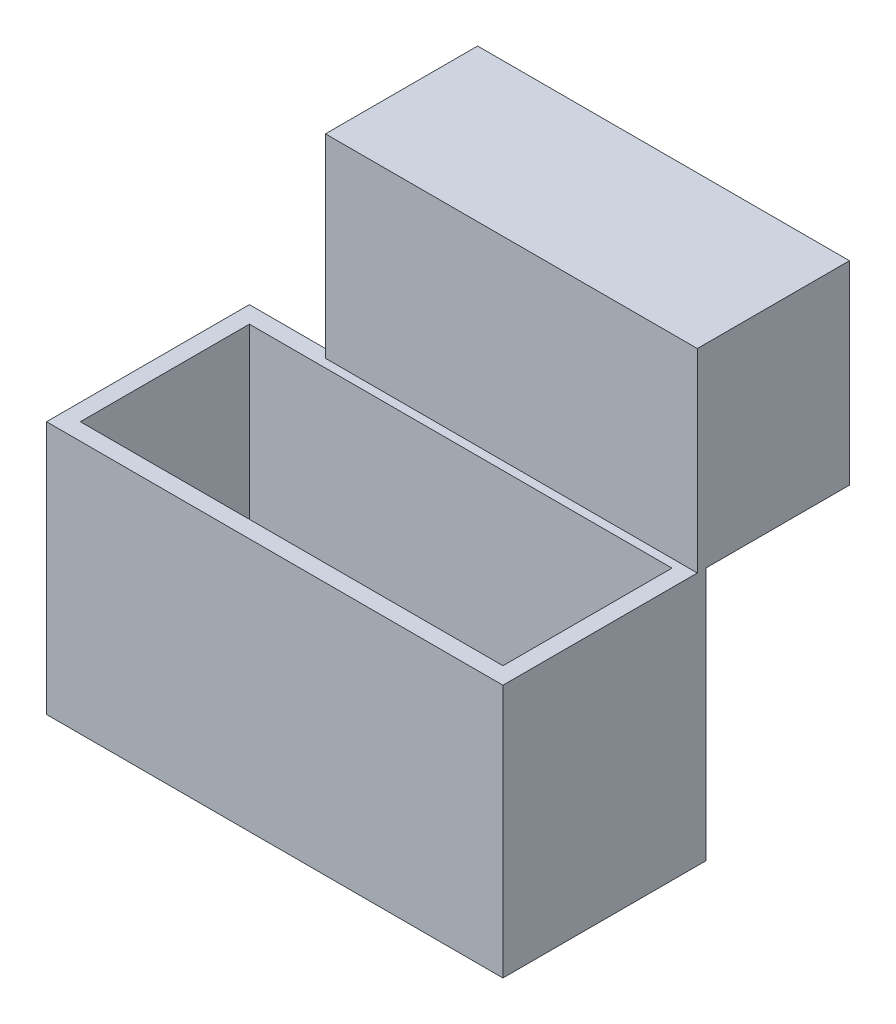
ISO-10303-21;
HEADER;
FILE_DESCRIPTION(('STEP AP214'),'2;1');
FILE_NAME('part.step','',(''),(''),'','','');
FILE_SCHEMA(('AUTOMOTIVE_DESIGN { 1 0 10303 214 1 1 1 1 }'));
ENDSEC;
DATA;
#1=APPLICATION_CONTEXT('core data for automotive mechanical design processes');
#2=APPLICATION_PROTOCOL_DEFINITION('international standard','automotive_design',2000,#1);
#3=PRODUCT_CONTEXT('',#1,'mechanical');
#4=PRODUCT('Part','Part','',(#3));
#5=PRODUCT_RELATED_PRODUCT_CATEGORY('part','',(#4));
#6=PRODUCT_DEFINITION_FORMATION('','',#4);
#7=PRODUCT_DEFINITION_CONTEXT('part definition',#1,'design');
#8=PRODUCT_DEFINITION('design','',#6,#7);
#9=PRODUCT_DEFINITION_SHAPE('','',#8);
#10=(LENGTH_UNIT() NAMED_UNIT(*) SI_UNIT(.MILLI.,.METRE.));
#11=(NAMED_UNIT(*) PLANE_ANGLE_UNIT() SI_UNIT($,.RADIAN.));
#12=(NAMED_UNIT(*) SI_UNIT($,.STERADIAN.) SOLID_ANGLE_UNIT());
#13=UNCERTAINTY_MEASURE_WITH_UNIT(LENGTH_MEASURE(1.E-05),#10,'distance_accuracy_value','');
#14=(GEOMETRIC_REPRESENTATION_CONTEXT(3) GLOBAL_UNCERTAINTY_ASSIGNED_CONTEXT((#13)) GLOBAL_UNIT_ASSIGNED_CONTEXT((#10,
#11,#12)) REPRESENTATION_CONTEXT('',''));
#15=CARTESIAN_POINT('',(0.,0.,0.));
#16=DIRECTION('',(0.,0.,1.));
#17=DIRECTION('',(1.,0.,0.));
#18=AXIS2_PLACEMENT_3D('',#15,#16,#17);
#19=CARTESIAN_POINT('',(0.,30.,0.));
#20=DIRECTION('',(0.,-1.,0.));
#21=DIRECTION('',(1.,0.,0.));
#22=AXIS2_PLACEMENT_3D('',#19,#20,#21);
#23=PLANE('',#22);
#24=DIRECTION('',(1.,0.,0.));
#25=VECTOR('',#24,1.);
#26=CARTESIAN_POINT('',(0.,30.,0.));
#27=LINE('',#26,#25);
#28=CARTESIAN_POINT('',(-50.,30.,0.));
#29=VERTEX_POINT('',#28);
#30=CARTESIAN_POINT('',(0.,30.,0.));
#31=VERTEX_POINT('',#30);
#32=EDGE_CURVE('E261',#29,#31,#27,.T.);
#33=ORIENTED_EDGE('',*,*,#32,.F.);
#34=DIRECTION('',(0.,0.,1.));
#35=VECTOR('',#34,1.);
#36=CARTESIAN_POINT('',(-50.,30.,0.));
#37=LINE('',#36,#35);
#38=CARTESIAN_POINT('',(-50.,30.,-20.));
#39=VERTEX_POINT('',#38);
#40=EDGE_CURVE('E327',#39,#29,#37,.T.);
#41=ORIENTED_EDGE('',*,*,#40,.F.);
#42=DIRECTION('',(-1.,0.,0.));
#43=VECTOR('',#42,1.);
#44=CARTESIAN_POINT('',(0.,30.,-20.));
#45=LINE('',#44,#43);
#46=CARTESIAN_POINT('',(0.,30.,-20.));
#47=VERTEX_POINT('',#46);
#48=EDGE_CURVE('E314',#47,#39,#45,.T.);
#49=ORIENTED_EDGE('',*,*,#48,.F.);
#50=DIRECTION('',(0.,0.,-1.));
#51=VECTOR('',#50,1.);
#52=CARTESIAN_POINT('',(0.,30.,0.));
#53=LINE('',#52,#51);
#54=EDGE_CURVE('E304',#31,#47,#53,.T.);
#55=ORIENTED_EDGE('',*,*,#54,.F.);
#56=EDGE_LOOP('',(#33,#41,#49,#55));
#57=FACE_BOUND('',#56,.T.);
#58=DIRECTION('',(-1.,0.,0.));
#59=VECTOR('',#58,1.);
#60=CARTESIAN_POINT('',(2.,30.,-21.));
#61=LINE('',#60,#59);
#62=CARTESIAN_POINT('',(2.,30.,-21.));
#63=VERTEX_POINT('',#62);
#64=CARTESIAN_POINT('',(-42.,30.,-21.));
#65=VERTEX_POINT('',#64);
#66=EDGE_CURVE('E232',#63,#65,#61,.T.);
#67=ORIENTED_EDGE('',*,*,#66,.T.);
#68=DIRECTION('',(0.,0.,-1.));
#69=VECTOR('',#68,1.);
#70=CARTESIAN_POINT('',(-42.,30.,-21.));
#71=LINE('',#70,#69);
#72=CARTESIAN_POINT('',(-42.,30.,-22.));
#73=VERTEX_POINT('',#72);
#74=EDGE_CURVE('E251',#65,#73,#71,.T.);
#75=ORIENTED_EDGE('',*,*,#74,.T.);
#76=DIRECTION('',(-1.,0.,0.));
#77=VECTOR('',#76,1.);
#78=CARTESIAN_POINT('',(0.,30.,-22.));
#79=LINE('',#78,#77);
#80=CARTESIAN_POINT('',(-52.,30.,-22.));
#81=VERTEX_POINT('',#80);
#82=EDGE_CURVE('E298',#73,#81,#79,.T.);
#83=ORIENTED_EDGE('',*,*,#82,.T.);
#84=DIRECTION('',(0.,0.,1.));
#85=VECTOR('',#84,1.);
#86=CARTESIAN_POINT('',(-52.,30.,0.));
#87=LINE('',#86,#85);
#88=CARTESIAN_POINT('',(-52.,30.,2.00000000000001));
#89=VERTEX_POINT('',#88);
#90=EDGE_CURVE('E274',#81,#89,#87,.T.);
#91=ORIENTED_EDGE('',*,*,#90,.T.);
#92=DIRECTION('',(1.,0.,0.));
#93=VECTOR('',#92,1.);
#94=CARTESIAN_POINT('',(0.,30.,2.));
#95=LINE('',#94,#93);
#96=CARTESIAN_POINT('',(2.,30.,2.));
#97=VERTEX_POINT('',#96);
#98=EDGE_CURVE('E291',#89,#97,#95,.T.);
#99=ORIENTED_EDGE('',*,*,#98,.T.);
#100=DIRECTION('',(0.,0.,-1.));
#101=VECTOR('',#100,1.);
#102=CARTESIAN_POINT('',(2.,30.,0.));
#103=LINE('',#102,#101);
#104=EDGE_CURVE('E292',#97,#63,#103,.T.);
#105=ORIENTED_EDGE('',*,*,#104,.T.);
#106=EDGE_LOOP('',(#67,#75,#83,#91,#99,#105));
#107=FACE_BOUND('',#106,.T.);
#108=ADVANCED_FACE('F57',(#57,#107),#23,.F.);
#109=CARTESIAN_POINT('',(0.,0.,-20.));
#110=DIRECTION('',(0.,-1.,0.));
#111=DIRECTION('',(-1.,0.,0.));
#112=AXIS2_PLACEMENT_3D('',#109,#110,#111);
#113=PLANE('',#112);
#114=DIRECTION('',(-1.,0.,0.));
#115=VECTOR('',#114,1.);
#116=CARTESIAN_POINT('',(0.,0.,-22.));
#117=LINE('',#116,#115);
#118=CARTESIAN_POINT('',(2.,0.,-22.));
#119=VERTEX_POINT('',#118);
#120=CARTESIAN_POINT('',(-52.,0.,-22.));
#121=VERTEX_POINT('',#120);
#122=EDGE_CURVE('E280',#119,#121,#117,.T.);
#123=ORIENTED_EDGE('',*,*,#122,.F.);
#124=DIRECTION('',(0.,0.,-1.));
#125=VECTOR('',#124,1.);
#126=CARTESIAN_POINT('',(2.,0.,0.));
#127=LINE('',#126,#125);
#128=CARTESIAN_POINT('',(2.,0.,2.));
#129=VERTEX_POINT('',#128);
#130=EDGE_CURVE('E66',#129,#119,#127,.T.);
#131=ORIENTED_EDGE('',*,*,#130,.F.);
#132=DIRECTION('',(1.,0.,0.));
#133=VECTOR('',#132,1.);
#134=CARTESIAN_POINT('',(0.,0.,2.));
#135=LINE('',#134,#133);
#136=CARTESIAN_POINT('',(-52.,0.,2.00000000000001));
#137=VERTEX_POINT('',#136);
#138=EDGE_CURVE('E275',#137,#129,#135,.T.);
#139=ORIENTED_EDGE('',*,*,#138,.F.);
#140=DIRECTION('',(0.,0.,1.));
#141=VECTOR('',#140,1.);
#142=CARTESIAN_POINT('',(-52.,0.,0.));
#143=LINE('',#142,#141);
#144=EDGE_CURVE('E286',#121,#137,#143,.T.);
#145=ORIENTED_EDGE('',*,*,#144,.F.);
#146=EDGE_LOOP('',(#123,#131,#139,#145));
#147=FACE_BOUND('',#146,.T.);
#148=ADVANCED_FACE('F59',(#147),#113,.T.);
#149=CARTESIAN_POINT('',(2.,0.,0.));
#150=DIRECTION('',(1.,0.,0.));
#151=DIRECTION('',(0.,0.,-1.));
#152=AXIS2_PLACEMENT_3D('',#149,#150,#151);
#153=PLANE('',#152);
#154=ORIENTED_EDGE('',*,*,#104,.F.);
#155=DIRECTION('',(0.,1.,0.));
#156=VECTOR('',#155,1.);
#157=CARTESIAN_POINT('',(2.,0.,2.));
#158=LINE('',#157,#156);
#159=EDGE_CURVE('E270',#129,#97,#158,.T.);
#160=ORIENTED_EDGE('',*,*,#159,.F.);
#161=ORIENTED_EDGE('',*,*,#130,.T.);
#162=DIRECTION('',(0.,1.,0.));
#163=VECTOR('',#162,1.);
#164=CARTESIAN_POINT('',(2.,0.,-22.));
#165=LINE('',#164,#163);
#166=CARTESIAN_POINT('',(2.,30.,-22.));
#167=VERTEX_POINT('',#166);
#168=EDGE_CURVE('E276',#119,#167,#165,.T.);
#169=ORIENTED_EDGE('',*,*,#168,.T.);
#170=DIRECTION('',(0.,0.,-1.));
#171=VECTOR('',#170,1.);
#172=CARTESIAN_POINT('',(2.,30.,-21.));
#173=LINE('',#172,#171);
#174=CARTESIAN_POINT('',(2.,30.,-39.));
#175=VERTEX_POINT('',#174);
#176=EDGE_CURVE('E242',#167,#175,#173,.T.);
#177=ORIENTED_EDGE('',*,*,#176,.T.);
#178=DIRECTION('',(0.,-1.,0.));
#179=VECTOR('',#178,1.);
#180=CARTESIAN_POINT('',(2.,30.,-39.));
#181=LINE('',#180,#179);
#182=CARTESIAN_POINT('',(2.,53.,-39.));
#183=VERTEX_POINT('',#182);
#184=EDGE_CURVE('E214',#183,#175,#181,.T.);
#185=ORIENTED_EDGE('',*,*,#184,.F.);
#186=DIRECTION('',(0.,0.,-1.));
#187=VECTOR('',#186,1.);
#188=CARTESIAN_POINT('',(2.,53.,-21.));
#189=LINE('',#188,#187);
#190=CARTESIAN_POINT('',(2.,53.,-21.));
#191=VERTEX_POINT('',#190);
#192=EDGE_CURVE('E243',#191,#183,#189,.T.);
#193=ORIENTED_EDGE('',*,*,#192,.F.);
#194=DIRECTION('',(0.,-1.,0.));
#195=VECTOR('',#194,1.);
#196=CARTESIAN_POINT('',(2.,30.,-21.));
#197=LINE('',#196,#195);
#198=EDGE_CURVE('E228',#191,#63,#197,.T.);
#199=ORIENTED_EDGE('',*,*,#198,.T.);
#200=EDGE_LOOP('',(#154,#160,#161,#169,#177,#185,#193,#199));
#201=FACE_BOUND('',#200,.T.);
#202=ADVANCED_FACE('F374',(#201),#153,.T.);
#203=CARTESIAN_POINT('',(0.,0.,-22.));
#204=DIRECTION('',(0.,0.,-1.));
#205=DIRECTION('',(-1.,0.,0.));
#206=AXIS2_PLACEMENT_3D('',#203,#204,#205);
#207=PLANE('',#206);
#208=EDGE_CURVE('E281',#167,#73,#79,.T.);
#209=ORIENTED_EDGE('',*,*,#208,.F.);
#210=ORIENTED_EDGE('',*,*,#168,.F.);
#211=ORIENTED_EDGE('',*,*,#122,.T.);
#212=DIRECTION('',(0.,1.,0.));
#213=VECTOR('',#212,1.);
#214=CARTESIAN_POINT('',(-52.,0.,-22.));
#215=LINE('',#214,#213);
#216=EDGE_CURVE('E282',#121,#81,#215,.T.);
#217=ORIENTED_EDGE('',*,*,#216,.T.);
#218=ORIENTED_EDGE('',*,*,#82,.F.);
#219=EDGE_LOOP('',(#209,#210,#211,#217,#218));
#220=FACE_BOUND('',#219,.T.);
#221=ADVANCED_FACE('F388',(#220),#207,.T.);
#222=CARTESIAN_POINT('',(-52.,0.,0.));
#223=DIRECTION('',(-1.,0.,0.));
#224=DIRECTION('',(0.,0.,1.));
#225=AXIS2_PLACEMENT_3D('',#222,#223,#224);
#226=PLANE('',#225);
#227=ORIENTED_EDGE('',*,*,#90,.F.);
#228=ORIENTED_EDGE('',*,*,#216,.F.);
#229=ORIENTED_EDGE('',*,*,#144,.T.);
#230=DIRECTION('',(0.,1.,0.));
#231=VECTOR('',#230,1.);
#232=CARTESIAN_POINT('',(-52.,0.,2.00000000000001));
#233=LINE('',#232,#231);
#234=EDGE_CURVE('E287',#137,#89,#233,.T.);
#235=ORIENTED_EDGE('',*,*,#234,.T.);
#236=EDGE_LOOP('',(#227,#228,#229,#235));
#237=FACE_BOUND('',#236,.T.);
#238=ADVANCED_FACE('F382',(#237),#226,.T.);
#239=CARTESIAN_POINT('',(0.,0.,2.));
#240=DIRECTION('',(0.,0.,1.));
#241=DIRECTION('',(1.,0.,0.));
#242=AXIS2_PLACEMENT_3D('',#239,#240,#241);
#243=PLANE('',#242);
#244=ORIENTED_EDGE('',*,*,#98,.F.);
#245=ORIENTED_EDGE('',*,*,#234,.F.);
#246=ORIENTED_EDGE('',*,*,#138,.T.);
#247=ORIENTED_EDGE('',*,*,#159,.T.);
#248=EDGE_LOOP('',(#244,#245,#246,#247));
#249=FACE_BOUND('',#248,.T.);
#250=ADVANCED_FACE('F378',(#249),#243,.T.);
#251=CARTESIAN_POINT('',(0.,0.,0.));
#252=DIRECTION('',(1.,0.,0.));
#253=DIRECTION('',(0.,0.,-1.));
#254=AXIS2_PLACEMENT_3D('',#251,#252,#253);
#255=PLANE('',#254);
#256=DIRECTION('',(0.,1.,0.));
#257=VECTOR('',#256,1.);
#258=CARTESIAN_POINT('',(0.,0.,-20.));
#259=LINE('',#258,#257);
#260=CARTESIAN_POINT('',(0.,2.,-20.));
#261=VERTEX_POINT('',#260);
#262=EDGE_CURVE('E318',#261,#47,#259,.T.);
#263=ORIENTED_EDGE('',*,*,#262,.F.);
#264=DIRECTION('',(0.,0.,1.));
#265=VECTOR('',#264,1.);
#266=CARTESIAN_POINT('',(0.,2.,-20.));
#267=LINE('',#266,#265);
#268=CARTESIAN_POINT('',(0.,2.,0.));
#269=VERTEX_POINT('',#268);
#270=EDGE_CURVE('E265',#269,#261,#267,.F.);
#271=ORIENTED_EDGE('',*,*,#270,.F.);
#272=DIRECTION('',(0.,1.,0.));
#273=VECTOR('',#272,1.);
#274=CARTESIAN_POINT('',(0.,0.,0.));
#275=LINE('',#274,#273);
#276=EDGE_CURVE('E331',#269,#31,#275,.T.);
#277=ORIENTED_EDGE('',*,*,#276,.T.);
#278=ORIENTED_EDGE('',*,*,#54,.T.);
#279=EDGE_LOOP('',(#263,#271,#277,#278));
#280=FACE_BOUND('',#279,.T.);
#281=ADVANCED_FACE('F342',(#280),#255,.F.);
#282=CARTESIAN_POINT('',(0.,0.,-20.));
#283=DIRECTION('',(0.,0.,-1.));
#284=DIRECTION('',(-1.,0.,0.));
#285=AXIS2_PLACEMENT_3D('',#282,#283,#284);
#286=PLANE('',#285);
#287=DIRECTION('',(0.,1.,0.));
#288=VECTOR('',#287,1.);
#289=CARTESIAN_POINT('',(-50.,0.,-20.));
#290=LINE('',#289,#288);
#291=CARTESIAN_POINT('',(-50.,2.,-20.));
#292=VERTEX_POINT('',#291);
#293=EDGE_CURVE('E319',#292,#39,#290,.T.);
#294=ORIENTED_EDGE('',*,*,#293,.F.);
#295=DIRECTION('',(1.,0.,0.));
#296=VECTOR('',#295,1.);
#297=CARTESIAN_POINT('',(-50.,2.,-20.));
#298=LINE('',#297,#296);
#299=EDGE_CURVE('E246',#261,#292,#298,.F.);
#300=ORIENTED_EDGE('',*,*,#299,.F.);
#301=ORIENTED_EDGE('',*,*,#262,.T.);
#302=ORIENTED_EDGE('',*,*,#48,.T.);
#303=EDGE_LOOP('',(#294,#300,#301,#302));
#304=FACE_BOUND('',#303,.T.);
#305=ADVANCED_FACE('F355',(#304),#286,.F.);
#306=CARTESIAN_POINT('',(-50.,0.,0.));
#307=DIRECTION('',(-1.,0.,0.));
#308=DIRECTION('',(0.,0.,1.));
#309=AXIS2_PLACEMENT_3D('',#306,#307,#308);
#310=PLANE('',#309);
#311=DIRECTION('',(0.,1.,0.));
#312=VECTOR('',#311,1.);
#313=CARTESIAN_POINT('',(-50.,0.,0.));
#314=LINE('',#313,#312);
#315=CARTESIAN_POINT('',(-50.,2.,0.));
#316=VERTEX_POINT('',#315);
#317=EDGE_CURVE('E326',#316,#29,#314,.T.);
#318=ORIENTED_EDGE('',*,*,#317,.F.);
#319=DIRECTION('',(0.,0.,1.));
#320=VECTOR('',#319,1.);
#321=CARTESIAN_POINT('',(-50.,2.,-20.));
#322=LINE('',#321,#320);
#323=EDGE_CURVE('E258',#292,#316,#322,.T.);
#324=ORIENTED_EDGE('',*,*,#323,.F.);
#325=ORIENTED_EDGE('',*,*,#293,.T.);
#326=ORIENTED_EDGE('',*,*,#40,.T.);
#327=EDGE_LOOP('',(#318,#324,#325,#326));
#328=FACE_BOUND('',#327,.T.);
#329=ADVANCED_FACE('F361',(#328),#310,.F.);
#330=CARTESIAN_POINT('',(0.,0.,0.));
#331=DIRECTION('',(0.,0.,1.));
#332=DIRECTION('',(1.,0.,0.));
#333=AXIS2_PLACEMENT_3D('',#330,#331,#332);
#334=PLANE('',#333);
#335=ORIENTED_EDGE('',*,*,#276,.F.);
#336=DIRECTION('',(1.,0.,0.));
#337=VECTOR('',#336,1.);
#338=CARTESIAN_POINT('',(-50.,2.,0.));
#339=LINE('',#338,#337);
#340=EDGE_CURVE('E262',#316,#269,#339,.T.);
#341=ORIENTED_EDGE('',*,*,#340,.F.);
#342=ORIENTED_EDGE('',*,*,#317,.T.);
#343=ORIENTED_EDGE('',*,*,#32,.T.);
#344=EDGE_LOOP('',(#335,#341,#342,#343));
#345=FACE_BOUND('',#344,.T.);
#346=ADVANCED_FACE('F347',(#345),#334,.F.);
#347=CARTESIAN_POINT('',(-50.,2.,-20.));
#348=DIRECTION('',(0.,1.,0.));
#349=DIRECTION('',(0.,0.,1.));
#350=AXIS2_PLACEMENT_3D('',#347,#348,#349);
#351=PLANE('',#350);
#352=ORIENTED_EDGE('',*,*,#323,.T.);
#353=ORIENTED_EDGE('',*,*,#340,.T.);
#354=ORIENTED_EDGE('',*,*,#270,.T.);
#355=ORIENTED_EDGE('',*,*,#299,.T.);
#356=EDGE_LOOP('',(#352,#353,#354,#355));
#357=FACE_BOUND('',#356,.T.);
#358=ADVANCED_FACE('F359',(#357),#351,.T.);
#359=CARTESIAN_POINT('',(2.,53.,-21.));
#360=DIRECTION('',(0.,1.,0.));
#361=DIRECTION('',(0.,0.,1.));
#362=AXIS2_PLACEMENT_3D('',#359,#360,#361);
#363=PLANE('',#362);
#364=ORIENTED_EDGE('',*,*,#192,.T.);
#365=DIRECTION('',(1.,0.,0.));
#366=VECTOR('',#365,1.);
#367=CARTESIAN_POINT('',(2.,53.,-39.));
#368=LINE('',#367,#366);
#369=CARTESIAN_POINT('',(-42.,53.,-39.));
#370=VERTEX_POINT('',#369);
#371=EDGE_CURVE('E224',#370,#183,#368,.T.);
#372=ORIENTED_EDGE('',*,*,#371,.F.);
#373=DIRECTION('',(0.,0.,-1.));
#374=VECTOR('',#373,1.);
#375=CARTESIAN_POINT('',(-42.,53.,-21.));
#376=LINE('',#375,#374);
#377=CARTESIAN_POINT('',(-42.,53.,-21.));
#378=VERTEX_POINT('',#377);
#379=EDGE_CURVE('E247',#378,#370,#376,.T.);
#380=ORIENTED_EDGE('',*,*,#379,.F.);
#381=DIRECTION('',(1.,0.,0.));
#382=VECTOR('',#381,1.);
#383=CARTESIAN_POINT('',(2.,53.,-21.));
#384=LINE('',#383,#382);
#385=EDGE_CURVE('E238',#378,#191,#384,.T.);
#386=ORIENTED_EDGE('',*,*,#385,.T.);
#387=EDGE_LOOP('',(#364,#372,#380,#386));
#388=FACE_BOUND('',#387,.T.);
#389=ADVANCED_FACE('F400',(#388),#363,.T.);
#390=CARTESIAN_POINT('',(-42.,30.,-21.));
#391=DIRECTION('',(-1.,0.,0.));
#392=DIRECTION('',(0.,0.,1.));
#393=AXIS2_PLACEMENT_3D('',#390,#391,#392);
#394=PLANE('',#393);
#395=DIRECTION('',(0.,0.,-1.));
#396=VECTOR('',#395,1.);
#397=CARTESIAN_POINT('',(-42.,51.,-21.));
#398=LINE('',#397,#396);
#399=CARTESIAN_POINT('',(-42.,51.,-27.6830313926151));
#400=VERTEX_POINT('',#399);
#401=CARTESIAN_POINT('',(-42.,51.,-39.));
#402=VERTEX_POINT('',#401);
#403=EDGE_CURVE('E210',#400,#402,#398,.T.);
#404=ORIENTED_EDGE('',*,*,#403,.F.);
#405=DIRECTION('',(0.,1.,0.));
#406=VECTOR('',#405,1.);
#407=CARTESIAN_POINT('',(-42.,30.,-27.6830313926151));
#408=LINE('',#407,#406);
#409=CARTESIAN_POINT('',(-42.,45.,-27.6830313926151));
#410=VERTEX_POINT('',#409);
#411=EDGE_CURVE('E12',#410,#400,#408,.T.);
#412=ORIENTED_EDGE('',*,*,#411,.F.);
#413=DIRECTION('',(0.,0.,1.));
#414=VECTOR('',#413,1.);
#415=CARTESIAN_POINT('',(-42.,45.,-21.));
#416=LINE('',#415,#414);
#417=CARTESIAN_POINT('',(-42.,45.,-39.));
#418=VERTEX_POINT('',#417);
#419=EDGE_CURVE('E207',#418,#410,#416,.T.);
#420=ORIENTED_EDGE('',*,*,#419,.F.);
#421=DIRECTION('',(0.,1.,0.));
#422=VECTOR('',#421,1.);
#423=CARTESIAN_POINT('',(-42.,30.,-39.));
#424=LINE('',#423,#422);
#425=CARTESIAN_POINT('',(-42.,30.,-39.));
#426=VERTEX_POINT('',#425);
#427=EDGE_CURVE('E197',#426,#418,#424,.T.);
#428=ORIENTED_EDGE('',*,*,#427,.F.);
#429=EDGE_CURVE('E255',#73,#426,#71,.T.);
#430=ORIENTED_EDGE('',*,*,#429,.F.);
#431=ORIENTED_EDGE('',*,*,#74,.F.);
#432=DIRECTION('',(0.,1.,0.));
#433=VECTOR('',#432,1.);
#434=CARTESIAN_POINT('',(-42.,30.,-21.));
#435=LINE('',#434,#433);
#436=EDGE_CURVE('E81',#65,#378,#435,.T.);
#437=ORIENTED_EDGE('',*,*,#436,.T.);
#438=ORIENTED_EDGE('',*,*,#379,.T.);
#439=EDGE_CURVE('E221',#402,#370,#424,.T.);
#440=ORIENTED_EDGE('',*,*,#439,.F.);
#441=EDGE_LOOP('',(#404,#412,#420,#428,#430,#431,#437,#438,#440));
#442=FACE_BOUND('',#441,.T.);
#443=ADVANCED_FACE('F405',(#442),#394,.T.);
#444=CARTESIAN_POINT('',(2.,30.,-21.));
#445=DIRECTION('',(0.,-1.,0.));
#446=DIRECTION('',(0.,0.,-1.));
#447=AXIS2_PLACEMENT_3D('',#444,#445,#446);
#448=PLANE('',#447);
#449=ORIENTED_EDGE('',*,*,#176,.F.);
#450=ORIENTED_EDGE('',*,*,#208,.T.);
#451=ORIENTED_EDGE('',*,*,#429,.T.);
#452=DIRECTION('',(-1.,0.,0.));
#453=VECTOR('',#452,1.);
#454=CARTESIAN_POINT('',(2.,30.,-39.));
#455=LINE('',#454,#453);
#456=EDGE_CURVE('E218',#175,#426,#455,.T.);
#457=ORIENTED_EDGE('',*,*,#456,.F.);
#458=EDGE_LOOP('',(#449,#450,#451,#457));
#459=FACE_BOUND('',#458,.T.);
#460=ADVANCED_FACE('F401',(#459),#448,.T.);
#461=CARTESIAN_POINT('',(0.,0.,-21.));
#462=DIRECTION('',(0.,0.,1.));
#463=DIRECTION('',(1.,0.,0.));
#464=AXIS2_PLACEMENT_3D('',#461,#462,#463);
#465=PLANE('',#464);
#466=ORIENTED_EDGE('',*,*,#198,.F.);
#467=ORIENTED_EDGE('',*,*,#385,.F.);
#468=ORIENTED_EDGE('',*,*,#436,.F.);
#469=ORIENTED_EDGE('',*,*,#66,.F.);
#470=EDGE_LOOP('',(#466,#467,#468,#469));
#471=FACE_BOUND('',#470,.T.);
#472=ADVANCED_FACE('F404',(#471),#465,.T.);
#473=CARTESIAN_POINT('',(0.,0.,-39.));
#474=DIRECTION('',(0.,0.,1.));
#475=DIRECTION('',(1.,0.,0.));
#476=AXIS2_PLACEMENT_3D('',#473,#474,#475);
#477=PLANE('',#476);
#478=DIRECTION('',(0.,-1.,0.));
#479=VECTOR('',#478,1.);
#480=CARTESIAN_POINT('',(-4.99999999999998,51.,-39.));
#481=LINE('',#480,#479);
#482=CARTESIAN_POINT('',(-4.99999999999998,51.,-39.));
#483=VERTEX_POINT('',#482);
#484=CARTESIAN_POINT('',(-4.99999999999998,45.,-39.));
#485=VERTEX_POINT('',#484);
#486=EDGE_CURVE('E185',#483,#485,#481,.T.);
#487=ORIENTED_EDGE('',*,*,#486,.F.);
#488=DIRECTION('',(-1.,0.,0.));
#489=VECTOR('',#488,1.);
#490=CARTESIAN_POINT('',(-4.99999999999998,51.,-39.));
#491=LINE('',#490,#489);
#492=EDGE_CURVE('E211',#483,#402,#491,.T.);
#493=ORIENTED_EDGE('',*,*,#492,.T.);
#494=ORIENTED_EDGE('',*,*,#439,.T.);
#495=ORIENTED_EDGE('',*,*,#371,.T.);
#496=ORIENTED_EDGE('',*,*,#184,.T.);
#497=ORIENTED_EDGE('',*,*,#456,.T.);
#498=ORIENTED_EDGE('',*,*,#427,.T.);
#499=DIRECTION('',(-1.,0.,0.));
#500=VECTOR('',#499,1.);
#501=CARTESIAN_POINT('',(-4.99999999999998,45.,-39.));
#502=LINE('',#501,#500);
#503=EDGE_CURVE('E178',#485,#418,#502,.T.);
#504=ORIENTED_EDGE('',*,*,#503,.F.);
#505=EDGE_LOOP('',(#487,#493,#494,#495,#496,#497,#498,#504));
#506=FACE_BOUND('',#505,.T.);
#507=ADVANCED_FACE('F194',(#506),#477,.F.);
#508=CARTESIAN_POINT('',(-4.99999999999998,51.,-39.));
#509=DIRECTION('',(0.,1.,0.));
#510=DIRECTION('',(0.,0.,1.));
#511=AXIS2_PLACEMENT_3D('',#508,#509,#510);
#512=PLANE('',#511);
#513=ORIENTED_EDGE('',*,*,#403,.T.);
#514=ORIENTED_EDGE('',*,*,#492,.F.);
#515=DIRECTION('',(0.,0.,-1.));
#516=VECTOR('',#515,1.);
#517=CARTESIAN_POINT('',(-4.99999999999998,51.,-39.));
#518=LINE('',#517,#516);
#519=CARTESIAN_POINT('',(-4.99999999999998,51.,-27.6830313926151));
#520=VERTEX_POINT('',#519);
#521=EDGE_CURVE('E73',#520,#483,#518,.T.);
#522=ORIENTED_EDGE('',*,*,#521,.F.);
#523=DIRECTION('',(-1.,0.,0.));
#524=VECTOR('',#523,1.);
#525=CARTESIAN_POINT('',(-4.99999999999998,51.,-27.6830313926151));
#526=LINE('',#525,#524);
#527=EDGE_CURVE('E202',#520,#400,#526,.T.);
#528=ORIENTED_EDGE('',*,*,#527,.T.);
#529=EDGE_LOOP('',(#513,#514,#522,#528));
#530=FACE_BOUND('',#529,.T.);
#531=ADVANCED_FACE('F417',(#530),#512,.F.);
#532=CARTESIAN_POINT('',(-4.99999999999998,51.,-27.6830313926151));
#533=DIRECTION('',(0.,0.,1.));
#534=DIRECTION('',(1.,0.,0.));
#535=AXIS2_PLACEMENT_3D('',#532,#533,#534);
#536=PLANE('',#535);
#537=ORIENTED_EDGE('',*,*,#411,.T.);
#538=ORIENTED_EDGE('',*,*,#527,.F.);
#539=DIRECTION('',(0.,1.,0.));
#540=VECTOR('',#539,1.);
#541=CARTESIAN_POINT('',(-4.99999999999998,51.,-27.6830313926151));
#542=LINE('',#541,#540);
#543=CARTESIAN_POINT('',(-4.99999999999998,45.,-27.6830313926151));
#544=VERTEX_POINT('',#543);
#545=EDGE_CURVE('E184',#544,#520,#542,.T.);
#546=ORIENTED_EDGE('',*,*,#545,.F.);
#547=DIRECTION('',(-1.,0.,0.));
#548=VECTOR('',#547,1.);
#549=CARTESIAN_POINT('',(-4.99999999999998,45.,-27.6830313926151));
#550=LINE('',#549,#548);
#551=EDGE_CURVE('E181',#544,#410,#550,.T.);
#552=ORIENTED_EDGE('',*,*,#551,.T.);
#553=EDGE_LOOP('',(#537,#538,#546,#552));
#554=FACE_BOUND('',#553,.T.);
#555=ADVANCED_FACE('F420',(#554),#536,.F.);
#556=CARTESIAN_POINT('',(-4.99999999999998,45.,-39.));
#557=DIRECTION('',(0.,-1.,0.));
#558=DIRECTION('',(0.,0.,-1.));
#559=AXIS2_PLACEMENT_3D('',#556,#557,#558);
#560=PLANE('',#559);
#561=ORIENTED_EDGE('',*,*,#419,.T.);
#562=ORIENTED_EDGE('',*,*,#551,.F.);
#563=DIRECTION('',(0.,0.,1.));
#564=VECTOR('',#563,1.);
#565=CARTESIAN_POINT('',(-4.99999999999998,45.,-39.));
#566=LINE('',#565,#564);
#567=EDGE_CURVE('E175',#485,#544,#566,.T.);
#568=ORIENTED_EDGE('',*,*,#567,.F.);
#569=ORIENTED_EDGE('',*,*,#503,.T.);
#570=EDGE_LOOP('',(#561,#562,#568,#569));
#571=FACE_BOUND('',#570,.T.);
#572=ADVANCED_FACE('F176',(#571),#560,.F.);
#573=CARTESIAN_POINT('',(-4.99999999999998,0.,0.));
#574=DIRECTION('',(-1.,0.,0.));
#575=DIRECTION('',(0.,0.,1.));
#576=AXIS2_PLACEMENT_3D('',#573,#574,#575);
#577=PLANE('',#576);
#578=ORIENTED_EDGE('',*,*,#486,.T.);
#579=ORIENTED_EDGE('',*,*,#567,.T.);
#580=ORIENTED_EDGE('',*,*,#545,.T.);
#581=ORIENTED_EDGE('',*,*,#521,.T.);
#582=EDGE_LOOP('',(#578,#579,#580,#581));
#583=FACE_BOUND('',#582,.T.);
#584=ADVANCED_FACE('F188',(#583),#577,.T.);
#585=CLOSED_SHELL('',(#108,#148,#202,#221,#238,#250,#281,#305,#329,#346,#358,#389,#443,#460,
#472,#507,#531,#555,#572,#584));
#586=MANIFOLD_SOLID_BREP('B2',#585);
#587=ADVANCED_BREP_SHAPE_REPRESENTATION('',(#18,#586),#14);
#588=SHAPE_DEFINITION_REPRESENTATION(#9,#587);
ENDSEC;
END-ISO-10303-21;
